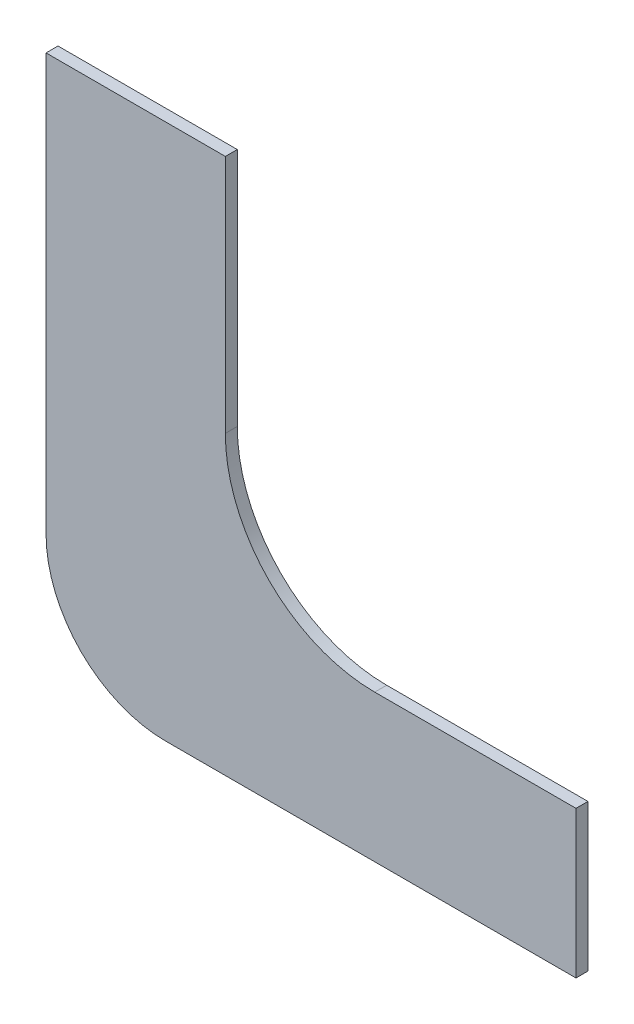
ISO-10303-21;
HEADER;
FILE_DESCRIPTION(('STEP AP214'),'2;1');
FILE_NAME('part.step','',(''),(''),'','','');
FILE_SCHEMA(('AUTOMOTIVE_DESIGN { 1 0 10303 214 1 1 1 1 }'));
ENDSEC;
DATA;
#1=APPLICATION_CONTEXT('core data for automotive mechanical design processes');
#2=APPLICATION_PROTOCOL_DEFINITION('international standard','automotive_design',2000,#1);
#3=PRODUCT_CONTEXT('',#1,'mechanical');
#4=PRODUCT('Part','Part','',(#3));
#5=PRODUCT_RELATED_PRODUCT_CATEGORY('part','',(#4));
#6=PRODUCT_DEFINITION_FORMATION('','',#4);
#7=PRODUCT_DEFINITION_CONTEXT('part definition',#1,'design');
#8=PRODUCT_DEFINITION('design','',#6,#7);
#9=PRODUCT_DEFINITION_SHAPE('','',#8);
#10=(LENGTH_UNIT() NAMED_UNIT(*) SI_UNIT(.MILLI.,.METRE.));
#11=(NAMED_UNIT(*) PLANE_ANGLE_UNIT() SI_UNIT($,.RADIAN.));
#12=(NAMED_UNIT(*) SI_UNIT($,.STERADIAN.) SOLID_ANGLE_UNIT());
#13=UNCERTAINTY_MEASURE_WITH_UNIT(LENGTH_MEASURE(1.E-05),#10,'distance_accuracy_value','');
#14=(GEOMETRIC_REPRESENTATION_CONTEXT(3) GLOBAL_UNCERTAINTY_ASSIGNED_CONTEXT((#13)) GLOBAL_UNIT_ASSIGNED_CONTEXT((#10,
#11,#12)) REPRESENTATION_CONTEXT('',''));
#15=CARTESIAN_POINT('',(0.,0.,0.));
#16=DIRECTION('',(0.,0.,1.));
#17=DIRECTION('',(1.,0.,0.));
#18=AXIS2_PLACEMENT_3D('',#15,#16,#17);
#19=CARTESIAN_POINT('',(0.15,0.35,0.01));
#20=DIRECTION('',(-1.,0.,0.));
#21=DIRECTION('',(0.,-1.,0.));
#22=AXIS2_PLACEMENT_3D('',#19,#20,#21);
#23=PLANE('',#22);
#24=DIRECTION('',(0.,1.,0.));
#25=VECTOR('',#24,1.);
#26=CARTESIAN_POINT('',(0.15,0.35,-0.01));
#27=LINE('',#26,#25);
#28=CARTESIAN_POINT('',(0.15,-0.0513748474086696,-0.01));
#29=VERTEX_POINT('',#28);
#30=CARTESIAN_POINT('',(0.15,0.35,-0.01));
#31=VERTEX_POINT('',#30);
#32=EDGE_CURVE('E129',#29,#31,#27,.T.);
#33=ORIENTED_EDGE('',*,*,#32,.T.);
#34=DIRECTION('',(0.,0.,-1.));
#35=VECTOR('',#34,1.);
#36=CARTESIAN_POINT('',(0.15,0.35,0.01));
#37=LINE('',#36,#35);
#38=CARTESIAN_POINT('',(0.15,0.35,0.01));
#39=VERTEX_POINT('',#38);
#40=EDGE_CURVE('E11',#39,#31,#37,.T.);
#41=ORIENTED_EDGE('',*,*,#40,.F.);
#42=DIRECTION('',(0.,1.,0.));
#43=VECTOR('',#42,1.);
#44=CARTESIAN_POINT('',(0.15,0.35,0.01));
#45=LINE('',#44,#43);
#46=CARTESIAN_POINT('',(0.15,-0.0513748474086696,0.01));
#47=VERTEX_POINT('',#46);
#48=EDGE_CURVE('E144',#47,#39,#45,.T.);
#49=ORIENTED_EDGE('',*,*,#48,.F.);
#50=DIRECTION('',(0.,0.,-1.));
#51=VECTOR('',#50,1.);
#52=CARTESIAN_POINT('',(0.15,-0.0513748474086696,0.01));
#53=LINE('',#52,#51);
#54=EDGE_CURVE('E125',#47,#29,#53,.T.);
#55=ORIENTED_EDGE('',*,*,#54,.T.);
#56=EDGE_LOOP('',(#33,#41,#49,#55));
#57=FACE_BOUND('',#56,.T.);
#58=ADVANCED_FACE('F33',(#57),#23,.F.);
#59=CARTESIAN_POINT('',(-0.15,0.35,0.01));
#60=DIRECTION('',(0.,-1.,0.));
#61=DIRECTION('',(0.,0.,-1.));
#62=AXIS2_PLACEMENT_3D('',#59,#60,#61);
#63=PLANE('',#62);
#64=DIRECTION('',(-1.,0.,0.));
#65=VECTOR('',#64,1.);
#66=CARTESIAN_POINT('',(-0.15,0.35,-0.01));
#67=LINE('',#66,#65);
#68=CARTESIAN_POINT('',(-0.15,0.35,-0.01));
#69=VERTEX_POINT('',#68);
#70=EDGE_CURVE('E132',#31,#69,#67,.T.);
#71=ORIENTED_EDGE('',*,*,#70,.T.);
#72=DIRECTION('',(0.,0.,-1.));
#73=VECTOR('',#72,1.);
#74=CARTESIAN_POINT('',(-0.15,0.35,0.01));
#75=LINE('',#74,#73);
#76=CARTESIAN_POINT('',(-0.15,0.35,0.01));
#77=VERTEX_POINT('',#76);
#78=EDGE_CURVE('E41',#77,#69,#75,.T.);
#79=ORIENTED_EDGE('',*,*,#78,.F.);
#80=DIRECTION('',(-1.,0.,0.));
#81=VECTOR('',#80,1.);
#82=CARTESIAN_POINT('',(-0.15,0.35,0.01));
#83=LINE('',#82,#81);
#84=EDGE_CURVE('E92',#39,#77,#83,.T.);
#85=ORIENTED_EDGE('',*,*,#84,.F.);
#86=ORIENTED_EDGE('',*,*,#40,.T.);
#87=EDGE_LOOP('',(#71,#79,#85,#86));
#88=FACE_BOUND('',#87,.T.);
#89=ADVANCED_FACE('F178',(#88),#63,.F.);
#90=CARTESIAN_POINT('',(-0.15,0.35,0.01));
#91=DIRECTION('',(1.,0.,0.));
#92=DIRECTION('',(0.,1.,0.));
#93=AXIS2_PLACEMENT_3D('',#90,#91,#92);
#94=PLANE('',#93);
#95=DIRECTION('',(0.,-1.,0.));
#96=VECTOR('',#95,1.);
#97=CARTESIAN_POINT('',(-0.15,0.35,-0.01));
#98=LINE('',#97,#96);
#99=CARTESIAN_POINT('',(-0.15,-0.347273546102289,-0.01));
#100=VERTEX_POINT('',#99);
#101=EDGE_CURVE('E134',#69,#100,#98,.T.);
#102=ORIENTED_EDGE('',*,*,#101,.T.);
#103=DIRECTION('',(0.,0.,-1.));
#104=VECTOR('',#103,1.);
#105=CARTESIAN_POINT('',(-0.15,-0.347273546102289,0.01));
#106=LINE('',#105,#104);
#107=CARTESIAN_POINT('',(-0.15,-0.347273546102289,0.01));
#108=VERTEX_POINT('',#107);
#109=EDGE_CURVE('E151',#108,#100,#106,.T.);
#110=ORIENTED_EDGE('',*,*,#109,.F.);
#111=DIRECTION('',(0.,-1.,0.));
#112=VECTOR('',#111,1.);
#113=CARTESIAN_POINT('',(-0.15,0.35,0.01));
#114=LINE('',#113,#112);
#115=EDGE_CURVE('E159',#77,#108,#114,.T.);
#116=ORIENTED_EDGE('',*,*,#115,.F.);
#117=ORIENTED_EDGE('',*,*,#78,.T.);
#118=EDGE_LOOP('',(#102,#110,#116,#117));
#119=FACE_BOUND('',#118,.T.);
#120=ADVANCED_FACE('F157',(#119),#94,.F.);
#121=CARTESIAN_POINT('',(0.05,-0.347273546102289,0.01));
#122=DIRECTION('',(0.,0.,-1.));
#123=DIRECTION('',(-1.,0.,0.));
#124=AXIS2_PLACEMENT_3D('',#121,#122,#123);
#125=CYLINDRICAL_SURFACE('',#124,0.2);
#126=CARTESIAN_POINT('',(0.05,-0.347273546102289,-0.01));
#127=DIRECTION('',(0.,0.,1.));
#128=DIRECTION('',(-1.,0.,0.));
#129=AXIS2_PLACEMENT_3D('',#126,#127,#128);
#130=CIRCLE('',#129,0.2);
#131=CARTESIAN_POINT('',(0.0500000000000001,-0.547273546102289,-0.01));
#132=VERTEX_POINT('',#131);
#133=EDGE_CURVE('E136',#100,#132,#130,.T.);
#134=ORIENTED_EDGE('',*,*,#133,.T.);
#135=DIRECTION('',(0.,0.,-1.));
#136=VECTOR('',#135,1.);
#137=CARTESIAN_POINT('',(0.0500000000000001,-0.547273546102289,0.01));
#138=LINE('',#137,#136);
#139=CARTESIAN_POINT('',(0.0500000000000001,-0.547273546102289,0.01));
#140=VERTEX_POINT('',#139);
#141=EDGE_CURVE('E148',#140,#132,#138,.T.);
#142=ORIENTED_EDGE('',*,*,#141,.F.);
#143=CARTESIAN_POINT('',(0.05,-0.347273546102289,0.01));
#144=DIRECTION('',(0.,0.,1.));
#145=DIRECTION('',(-1.,0.,0.));
#146=AXIS2_PLACEMENT_3D('',#143,#144,#145);
#147=CIRCLE('',#146,0.2);
#148=EDGE_CURVE('E170',#108,#140,#147,.T.);
#149=ORIENTED_EDGE('',*,*,#148,.F.);
#150=ORIENTED_EDGE('',*,*,#109,.T.);
#151=EDGE_LOOP('',(#134,#142,#149,#150));
#152=FACE_BOUND('',#151,.T.);
#153=ADVANCED_FACE('F166',(#152),#125,.T.);
#154=CARTESIAN_POINT('',(0.15,-0.547273546102289,0.01));
#155=DIRECTION('',(0.,1.,0.));
#156=DIRECTION('',(0.,0.,1.));
#157=AXIS2_PLACEMENT_3D('',#154,#155,#156);
#158=PLANE('',#157);
#159=DIRECTION('',(1.,0.,0.));
#160=VECTOR('',#159,1.);
#161=CARTESIAN_POINT('',(0.15,-0.547273546102289,-0.01));
#162=LINE('',#161,#160);
#163=CARTESIAN_POINT('',(0.736808624207441,-0.547273546102289,-0.01));
#164=VERTEX_POINT('',#163);
#165=EDGE_CURVE('E139',#132,#164,#162,.T.);
#166=ORIENTED_EDGE('',*,*,#165,.T.);
#167=DIRECTION('',(0.,0.,-1.));
#168=VECTOR('',#167,1.);
#169=CARTESIAN_POINT('',(0.736808624207441,-0.547273546102289,0.01));
#170=LINE('',#169,#168);
#171=CARTESIAN_POINT('',(0.736808624207441,-0.547273546102289,0.01));
#172=VERTEX_POINT('',#171);
#173=EDGE_CURVE('E120',#172,#164,#170,.T.);
#174=ORIENTED_EDGE('',*,*,#173,.F.);
#175=DIRECTION('',(1.,0.,0.));
#176=VECTOR('',#175,1.);
#177=CARTESIAN_POINT('',(0.05,-0.547273546102289,0.01));
#178=LINE('',#177,#176);
#179=EDGE_CURVE('E111',#140,#172,#178,.T.);
#180=ORIENTED_EDGE('',*,*,#179,.F.);
#181=ORIENTED_EDGE('',*,*,#141,.T.);
#182=EDGE_LOOP('',(#166,#174,#180,#181));
#183=FACE_BOUND('',#182,.T.);
#184=ADVANCED_FACE('F169',(#183),#158,.F.);
#185=CARTESIAN_POINT('',(0.736808624207441,-0.30137484740867,0.01));
#186=DIRECTION('',(-1.,0.,0.));
#187=DIRECTION('',(0.,-1.,0.));
#188=AXIS2_PLACEMENT_3D('',#185,#186,#187);
#189=PLANE('',#188);
#190=DIRECTION('',(0.,1.,0.));
#191=VECTOR('',#190,1.);
#192=CARTESIAN_POINT('',(0.736808624207441,-0.30137484740867,-0.01));
#193=LINE('',#192,#191);
#194=CARTESIAN_POINT('',(0.736808624207441,-0.30137484740867,-0.01));
#195=VERTEX_POINT('',#194);
#196=EDGE_CURVE('E119',#164,#195,#193,.T.);
#197=ORIENTED_EDGE('',*,*,#196,.T.);
#198=DIRECTION('',(0.,0.,-1.));
#199=VECTOR('',#198,1.);
#200=CARTESIAN_POINT('',(0.736808624207441,-0.30137484740867,0.01));
#201=LINE('',#200,#199);
#202=CARTESIAN_POINT('',(0.736808624207441,-0.30137484740867,0.01));
#203=VERTEX_POINT('',#202);
#204=EDGE_CURVE('E116',#203,#195,#201,.T.);
#205=ORIENTED_EDGE('',*,*,#204,.F.);
#206=DIRECTION('',(0.,1.,0.));
#207=VECTOR('',#206,1.);
#208=CARTESIAN_POINT('',(0.736808624207441,-0.30137484740867,0.01));
#209=LINE('',#208,#207);
#210=EDGE_CURVE('E105',#172,#203,#209,.T.);
#211=ORIENTED_EDGE('',*,*,#210,.F.);
#212=ORIENTED_EDGE('',*,*,#173,.T.);
#213=EDGE_LOOP('',(#197,#205,#211,#212));
#214=FACE_BOUND('',#213,.T.);
#215=ADVANCED_FACE('F117',(#214),#189,.F.);
#216=CARTESIAN_POINT('',(0.4,-0.30137484740867,0.01));
#217=DIRECTION('',(0.,-1.,0.));
#218=DIRECTION('',(0.,0.,-1.));
#219=AXIS2_PLACEMENT_3D('',#216,#217,#218);
#220=PLANE('',#219);
#221=DIRECTION('',(-1.,0.,0.));
#222=VECTOR('',#221,1.);
#223=CARTESIAN_POINT('',(0.4,-0.30137484740867,-0.01));
#224=LINE('',#223,#222);
#225=CARTESIAN_POINT('',(0.4,-0.30137484740867,-0.01));
#226=VERTEX_POINT('',#225);
#227=EDGE_CURVE('E78',#195,#226,#224,.T.);
#228=ORIENTED_EDGE('',*,*,#227,.T.);
#229=DIRECTION('',(0.,0.,-1.));
#230=VECTOR('',#229,1.);
#231=CARTESIAN_POINT('',(0.4,-0.30137484740867,0.01));
#232=LINE('',#231,#230);
#233=CARTESIAN_POINT('',(0.4,-0.30137484740867,0.01));
#234=VERTEX_POINT('',#233);
#235=EDGE_CURVE('E121',#234,#226,#232,.T.);
#236=ORIENTED_EDGE('',*,*,#235,.F.);
#237=DIRECTION('',(-1.,0.,0.));
#238=VECTOR('',#237,1.);
#239=CARTESIAN_POINT('',(0.4,-0.30137484740867,0.01));
#240=LINE('',#239,#238);
#241=EDGE_CURVE('E109',#203,#234,#240,.T.);
#242=ORIENTED_EDGE('',*,*,#241,.F.);
#243=ORIENTED_EDGE('',*,*,#204,.T.);
#244=EDGE_LOOP('',(#228,#236,#242,#243));
#245=FACE_BOUND('',#244,.T.);
#246=ADVANCED_FACE('F123',(#245),#220,.F.);
#247=CARTESIAN_POINT('',(0.4,-0.0513748474086696,0.01));
#248=DIRECTION('',(0.,0.,-1.));
#249=DIRECTION('',(-1.,0.,0.));
#250=AXIS2_PLACEMENT_3D('',#247,#248,#249);
#251=CYLINDRICAL_SURFACE('',#250,0.25);
#252=CARTESIAN_POINT('',(0.4,-0.0513748474086696,-0.01));
#253=DIRECTION('',(0.,0.,-1.));
#254=DIRECTION('',(-1.,0.,0.));
#255=AXIS2_PLACEMENT_3D('',#252,#253,#254);
#256=CIRCLE('',#255,0.25);
#257=EDGE_CURVE('E84',#226,#29,#256,.T.);
#258=ORIENTED_EDGE('',*,*,#257,.T.);
#259=ORIENTED_EDGE('',*,*,#54,.F.);
#260=CARTESIAN_POINT('',(0.4,-0.0513748474086696,0.01));
#261=DIRECTION('',(0.,0.,-1.));
#262=DIRECTION('',(-1.,0.,0.));
#263=AXIS2_PLACEMENT_3D('',#260,#261,#262);
#264=CIRCLE('',#263,0.25);
#265=EDGE_CURVE('E49',#234,#47,#264,.T.);
#266=ORIENTED_EDGE('',*,*,#265,.F.);
#267=ORIENTED_EDGE('',*,*,#235,.T.);
#268=EDGE_LOOP('',(#258,#259,#266,#267));
#269=FACE_BOUND('',#268,.T.);
#270=ADVANCED_FACE('F194',(#269),#251,.F.);
#271=CARTESIAN_POINT('',(0.4,-0.0513748474086696,0.01));
#272=DIRECTION('',(0.,0.,-1.));
#273=DIRECTION('',(-1.,0.,0.));
#274=AXIS2_PLACEMENT_3D('',#271,#272,#273);
#275=PLANE('',#274);
#276=ORIENTED_EDGE('',*,*,#48,.T.);
#277=ORIENTED_EDGE('',*,*,#84,.T.);
#278=ORIENTED_EDGE('',*,*,#115,.T.);
#279=ORIENTED_EDGE('',*,*,#148,.T.);
#280=ORIENTED_EDGE('',*,*,#179,.T.);
#281=ORIENTED_EDGE('',*,*,#210,.T.);
#282=ORIENTED_EDGE('',*,*,#241,.T.);
#283=ORIENTED_EDGE('',*,*,#265,.T.);
#284=EDGE_LOOP('',(#276,#277,#278,#279,#280,#281,#282,#283));
#285=FACE_BOUND('',#284,.T.);
#286=ADVANCED_FACE('F107',(#285),#275,.F.);
#287=CARTESIAN_POINT('',(0.4,-0.0513748474086696,-0.01));
#288=DIRECTION('',(0.,0.,-1.));
#289=DIRECTION('',(-1.,0.,0.));
#290=AXIS2_PLACEMENT_3D('',#287,#288,#289);
#291=PLANE('',#290);
#292=ORIENTED_EDGE('',*,*,#32,.F.);
#293=ORIENTED_EDGE('',*,*,#257,.F.);
#294=ORIENTED_EDGE('',*,*,#227,.F.);
#295=ORIENTED_EDGE('',*,*,#196,.F.);
#296=ORIENTED_EDGE('',*,*,#165,.F.);
#297=ORIENTED_EDGE('',*,*,#133,.F.);
#298=ORIENTED_EDGE('',*,*,#101,.F.);
#299=ORIENTED_EDGE('',*,*,#70,.F.);
#300=EDGE_LOOP('',(#292,#293,#294,#295,#296,#297,#298,#299));
#301=FACE_BOUND('',#300,.T.);
#302=ADVANCED_FACE('F163',(#301),#291,.T.);
#303=CLOSED_SHELL('',(#58,#89,#120,#153,#184,#215,#246,#270,#286,#302));
#304=MANIFOLD_SOLID_BREP('B2',#303);
#305=ADVANCED_BREP_SHAPE_REPRESENTATION('',(#18,#304),#14);
#306=SHAPE_DEFINITION_REPRESENTATION(#9,#305);
ENDSEC;
END-ISO-10303-21;
